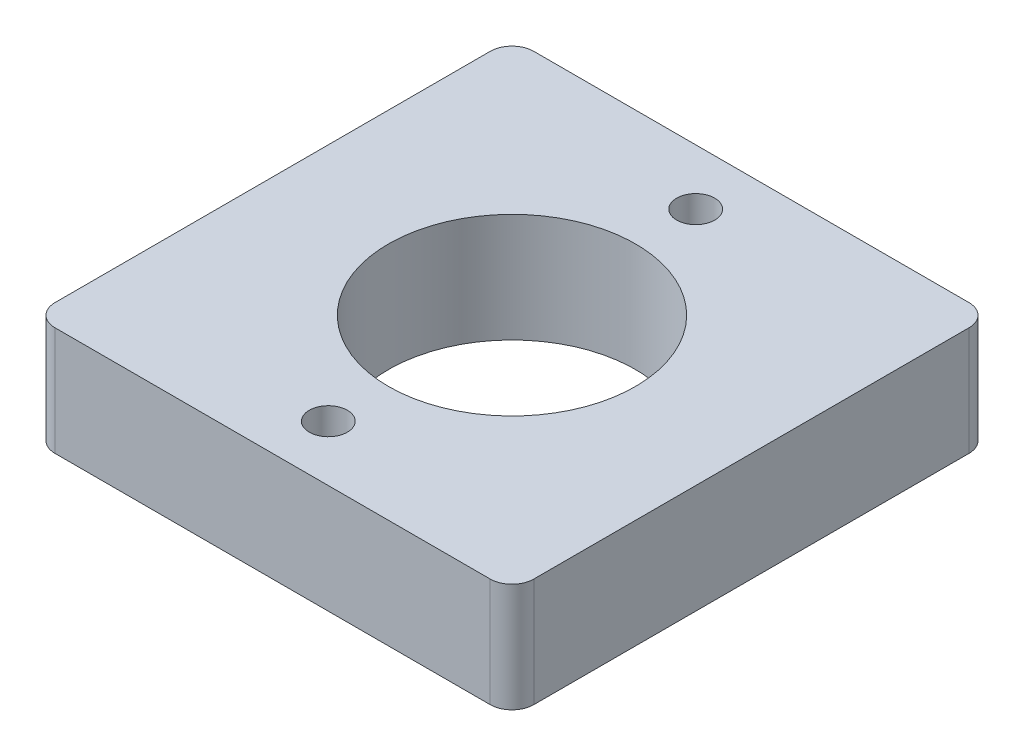
ISO-10303-21;
HEADER;
FILE_DESCRIPTION(('STEP AP214'),'2;1');
FILE_NAME('part.step','',(''),(''),'','','');
FILE_SCHEMA(('AUTOMOTIVE_DESIGN { 1 0 10303 214 1 1 1 1 }'));
ENDSEC;
DATA;
#1=APPLICATION_CONTEXT('core data for automotive mechanical design processes');
#2=APPLICATION_PROTOCOL_DEFINITION('international standard','automotive_design',2000,#1);
#3=PRODUCT_CONTEXT('',#1,'mechanical');
#4=PRODUCT('Part','Part','',(#3));
#5=PRODUCT_RELATED_PRODUCT_CATEGORY('part','',(#4));
#6=PRODUCT_DEFINITION_FORMATION('','',#4);
#7=PRODUCT_DEFINITION_CONTEXT('part definition',#1,'design');
#8=PRODUCT_DEFINITION('design','',#6,#7);
#9=PRODUCT_DEFINITION_SHAPE('','',#8);
#10=(LENGTH_UNIT() NAMED_UNIT(*) SI_UNIT(.MILLI.,.METRE.));
#11=(NAMED_UNIT(*) PLANE_ANGLE_UNIT() SI_UNIT($,.RADIAN.));
#12=(NAMED_UNIT(*) SI_UNIT($,.STERADIAN.) SOLID_ANGLE_UNIT());
#13=UNCERTAINTY_MEASURE_WITH_UNIT(LENGTH_MEASURE(1.E-05),#10,'distance_accuracy_value','');
#14=(GEOMETRIC_REPRESENTATION_CONTEXT(3) GLOBAL_UNCERTAINTY_ASSIGNED_CONTEXT((#13)) GLOBAL_UNIT_ASSIGNED_CONTEXT((#10,
#11,#12)) REPRESENTATION_CONTEXT('',''));
#15=CARTESIAN_POINT('',(0.,0.,0.));
#16=DIRECTION('',(0.,0.,1.));
#17=DIRECTION('',(1.,0.,0.));
#18=AXIS2_PLACEMENT_3D('',#15,#16,#17);
#19=CARTESIAN_POINT('',(0.,10.,0.));
#20=DIRECTION('',(0.,-1.,0.));
#21=DIRECTION('',(0.,0.,-1.));
#22=AXIS2_PLACEMENT_3D('',#19,#20,#21);
#23=PLANE('',#22);
#24=CARTESIAN_POINT('',(0.,10.,-16.88));
#25=DIRECTION('',(0.,1.,0.));
#26=DIRECTION('',(0.,0.,1.));
#27=AXIS2_PLACEMENT_3D('',#24,#25,#26);
#28=CIRCLE('',#27,1.75);
#29=CARTESIAN_POINT('',(0.,10.,-15.13));
#30=VERTEX_POINT('',#29);
#31=EDGE_CURVE('E192',#30,#30,#28,.T.);
#32=ORIENTED_EDGE('',*,*,#31,.F.);
#33=EDGE_LOOP('',(#32));
#34=FACE_BOUND('',#33,.T.);
#35=CARTESIAN_POINT('',(0.,10.,16.88));
#36=DIRECTION('',(0.,1.,0.));
#37=DIRECTION('',(0.,0.,1.));
#38=AXIS2_PLACEMENT_3D('',#35,#36,#37);
#39=CIRCLE('',#38,1.75);
#40=CARTESIAN_POINT('',(0.,10.,18.63));
#41=VERTEX_POINT('',#40);
#42=EDGE_CURVE('E186',#41,#41,#39,.T.);
#43=ORIENTED_EDGE('',*,*,#42,.F.);
#44=EDGE_LOOP('',(#43));
#45=FACE_BOUND('',#44,.T.);
#46=DIRECTION('',(0.,0.,-1.));
#47=VECTOR('',#46,1.);
#48=CARTESIAN_POINT('',(22.,10.,22.));
#49=LINE('',#48,#47);
#50=CARTESIAN_POINT('',(22.,10.,20.));
#51=VERTEX_POINT('',#50);
#52=CARTESIAN_POINT('',(22.,10.,-20.));
#53=VERTEX_POINT('',#52);
#54=EDGE_CURVE('E140',#51,#53,#49,.T.);
#55=ORIENTED_EDGE('',*,*,#54,.T.);
#56=CARTESIAN_POINT('',(20.,10.,-20.));
#57=DIRECTION('',(0.,-1.,0.));
#58=DIRECTION('',(0.,0.,-1.));
#59=AXIS2_PLACEMENT_3D('',#56,#57,#58);
#60=CIRCLE('',#59,2.);
#61=CARTESIAN_POINT('',(20.,10.,-22.));
#62=VERTEX_POINT('',#61);
#63=EDGE_CURVE('E155',#53,#62,#60,.F.);
#64=ORIENTED_EDGE('',*,*,#63,.T.);
#65=DIRECTION('',(-1.,0.,0.));
#66=VECTOR('',#65,1.);
#67=CARTESIAN_POINT('',(-22.,10.,-22.));
#68=LINE('',#67,#66);
#69=CARTESIAN_POINT('',(-20.,10.,-22.));
#70=VERTEX_POINT('',#69);
#71=EDGE_CURVE('E122',#62,#70,#68,.T.);
#72=ORIENTED_EDGE('',*,*,#71,.T.);
#73=CARTESIAN_POINT('',(-20.,10.,-20.));
#74=DIRECTION('',(0.,-1.,0.));
#75=DIRECTION('',(0.,0.,-1.));
#76=AXIS2_PLACEMENT_3D('',#73,#74,#75);
#77=CIRCLE('',#76,2.);
#78=CARTESIAN_POINT('',(-22.,10.,-20.));
#79=VERTEX_POINT('',#78);
#80=EDGE_CURVE('E150',#70,#79,#77,.F.);
#81=ORIENTED_EDGE('',*,*,#80,.T.);
#82=DIRECTION('',(0.,0.,1.));
#83=VECTOR('',#82,1.);
#84=CARTESIAN_POINT('',(-22.,10.,22.));
#85=LINE('',#84,#83);
#86=CARTESIAN_POINT('',(-22.,10.,20.));
#87=VERTEX_POINT('',#86);
#88=EDGE_CURVE('E166',#79,#87,#85,.T.);
#89=ORIENTED_EDGE('',*,*,#88,.T.);
#90=CARTESIAN_POINT('',(-20.,10.,20.));
#91=DIRECTION('',(0.,-1.,0.));
#92=DIRECTION('',(0.,0.,-1.));
#93=AXIS2_PLACEMENT_3D('',#90,#91,#92);
#94=CIRCLE('',#93,2.);
#95=CARTESIAN_POINT('',(-20.,10.,22.));
#96=VERTEX_POINT('',#95);
#97=EDGE_CURVE('E58',#87,#96,#94,.F.);
#98=ORIENTED_EDGE('',*,*,#97,.T.);
#99=DIRECTION('',(1.,0.,0.));
#100=VECTOR('',#99,1.);
#101=CARTESIAN_POINT('',(-22.,10.,22.));
#102=LINE('',#101,#100);
#103=CARTESIAN_POINT('',(20.,10.,22.));
#104=VERTEX_POINT('',#103);
#105=EDGE_CURVE('E141',#96,#104,#102,.T.);
#106=ORIENTED_EDGE('',*,*,#105,.T.);
#107=CARTESIAN_POINT('',(20.,10.,20.));
#108=DIRECTION('',(0.,-1.,0.));
#109=DIRECTION('',(0.,0.,-1.));
#110=AXIS2_PLACEMENT_3D('',#107,#108,#109);
#111=CIRCLE('',#110,2.);
#112=EDGE_CURVE('E153',#104,#51,#111,.F.);
#113=ORIENTED_EDGE('',*,*,#112,.T.);
#114=EDGE_LOOP('',(#55,#64,#72,#81,#89,#98,#106,#113));
#115=FACE_BOUND('',#114,.T.);
#116=CARTESIAN_POINT('',(0.,10.,0.));
#117=DIRECTION('',(0.,1.,0.));
#118=DIRECTION('',(0.,0.,1.));
#119=AXIS2_PLACEMENT_3D('',#116,#117,#118);
#120=CIRCLE('',#119,11.35);
#121=CARTESIAN_POINT('',(0.,10.,11.35));
#122=VERTEX_POINT('',#121);
#123=EDGE_CURVE('E135',#122,#122,#120,.T.);
#124=ORIENTED_EDGE('',*,*,#123,.F.);
#125=EDGE_LOOP('',(#124));
#126=FACE_BOUND('',#125,.T.);
#127=ADVANCED_FACE('F36',(#34,#45,#115,#126),#23,.F.);
#128=CARTESIAN_POINT('',(0.,0.,0.));
#129=DIRECTION('',(0.,-1.,0.));
#130=DIRECTION('',(0.,0.,-1.));
#131=AXIS2_PLACEMENT_3D('',#128,#129,#130);
#132=PLANE('',#131);
#133=CARTESIAN_POINT('',(0.,0.,-16.88));
#134=DIRECTION('',(0.,1.,0.));
#135=DIRECTION('',(0.,0.,1.));
#136=AXIS2_PLACEMENT_3D('',#133,#134,#135);
#137=CIRCLE('',#136,1.75);
#138=CARTESIAN_POINT('',(0.,0.,-15.13));
#139=VERTEX_POINT('',#138);
#140=EDGE_CURVE('E183',#139,#139,#137,.T.);
#141=ORIENTED_EDGE('',*,*,#140,.T.);
#142=EDGE_LOOP('',(#141));
#143=FACE_BOUND('',#142,.T.);
#144=CARTESIAN_POINT('',(0.,0.,16.88));
#145=DIRECTION('',(0.,1.,0.));
#146=DIRECTION('',(0.,0.,1.));
#147=AXIS2_PLACEMENT_3D('',#144,#145,#146);
#148=CIRCLE('',#147,1.75);
#149=CARTESIAN_POINT('',(0.,0.,18.63));
#150=VERTEX_POINT('',#149);
#151=EDGE_CURVE('E189',#150,#150,#148,.T.);
#152=ORIENTED_EDGE('',*,*,#151,.T.);
#153=EDGE_LOOP('',(#152));
#154=FACE_BOUND('',#153,.T.);
#155=DIRECTION('',(-1.,0.,0.));
#156=VECTOR('',#155,1.);
#157=CARTESIAN_POINT('',(-22.,0.,-22.));
#158=LINE('',#157,#156);
#159=CARTESIAN_POINT('',(20.,0.,-22.));
#160=VERTEX_POINT('',#159);
#161=CARTESIAN_POINT('',(-20.,0.,-22.));
#162=VERTEX_POINT('',#161);
#163=EDGE_CURVE('E119',#160,#162,#158,.T.);
#164=ORIENTED_EDGE('',*,*,#163,.F.);
#165=CARTESIAN_POINT('',(20.,0.,-20.));
#166=DIRECTION('',(0.,-1.,0.));
#167=DIRECTION('',(0.,0.,-1.));
#168=AXIS2_PLACEMENT_3D('',#165,#166,#167);
#169=CIRCLE('',#168,2.);
#170=CARTESIAN_POINT('',(22.,0.,-20.));
#171=VERTEX_POINT('',#170);
#172=EDGE_CURVE('E102',#160,#171,#169,.T.);
#173=ORIENTED_EDGE('',*,*,#172,.T.);
#174=DIRECTION('',(0.,0.,-1.));
#175=VECTOR('',#174,1.);
#176=CARTESIAN_POINT('',(22.,0.,22.));
#177=LINE('',#176,#175);
#178=CARTESIAN_POINT('',(22.,0.,20.));
#179=VERTEX_POINT('',#178);
#180=EDGE_CURVE('E130',#179,#171,#177,.T.);
#181=ORIENTED_EDGE('',*,*,#180,.F.);
#182=CARTESIAN_POINT('',(20.,0.,20.));
#183=DIRECTION('',(0.,-1.,0.));
#184=DIRECTION('',(0.,0.,-1.));
#185=AXIS2_PLACEMENT_3D('',#182,#183,#184);
#186=CIRCLE('',#185,2.);
#187=CARTESIAN_POINT('',(20.,0.,22.));
#188=VERTEX_POINT('',#187);
#189=EDGE_CURVE('E113',#179,#188,#186,.T.);
#190=ORIENTED_EDGE('',*,*,#189,.T.);
#191=DIRECTION('',(1.,0.,0.));
#192=VECTOR('',#191,1.);
#193=CARTESIAN_POINT('',(-22.,0.,22.));
#194=LINE('',#193,#192);
#195=CARTESIAN_POINT('',(-20.,0.,22.));
#196=VERTEX_POINT('',#195);
#197=EDGE_CURVE('E133',#196,#188,#194,.T.);
#198=ORIENTED_EDGE('',*,*,#197,.F.);
#199=CARTESIAN_POINT('',(-20.,0.,20.));
#200=DIRECTION('',(0.,-1.,0.));
#201=DIRECTION('',(0.,0.,-1.));
#202=AXIS2_PLACEMENT_3D('',#199,#200,#201);
#203=CIRCLE('',#202,2.);
#204=CARTESIAN_POINT('',(-22.,0.,20.));
#205=VERTEX_POINT('',#204);
#206=EDGE_CURVE('E144',#196,#205,#203,.T.);
#207=ORIENTED_EDGE('',*,*,#206,.T.);
#208=DIRECTION('',(0.,0.,1.));
#209=VECTOR('',#208,1.);
#210=CARTESIAN_POINT('',(-22.,0.,22.));
#211=LINE('',#210,#209);
#212=CARTESIAN_POINT('',(-22.,0.,-20.));
#213=VERTEX_POINT('',#212);
#214=EDGE_CURVE('E129',#213,#205,#211,.T.);
#215=ORIENTED_EDGE('',*,*,#214,.F.);
#216=CARTESIAN_POINT('',(-20.,0.,-20.));
#217=DIRECTION('',(0.,-1.,0.));
#218=DIRECTION('',(0.,0.,-1.));
#219=AXIS2_PLACEMENT_3D('',#216,#217,#218);
#220=CIRCLE('',#219,2.);
#221=EDGE_CURVE('E123',#213,#162,#220,.T.);
#222=ORIENTED_EDGE('',*,*,#221,.T.);
#223=EDGE_LOOP('',(#164,#173,#181,#190,#198,#207,#215,#222));
#224=FACE_BOUND('',#223,.T.);
#225=CARTESIAN_POINT('',(0.,0.,0.));
#226=DIRECTION('',(0.,1.,0.));
#227=DIRECTION('',(0.,0.,1.));
#228=AXIS2_PLACEMENT_3D('',#225,#226,#227);
#229=CIRCLE('',#228,11.35);
#230=CARTESIAN_POINT('',(0.,0.,11.35));
#231=VERTEX_POINT('',#230);
#232=EDGE_CURVE('E180',#231,#231,#229,.T.);
#233=ORIENTED_EDGE('',*,*,#232,.T.);
#234=EDGE_LOOP('',(#233));
#235=FACE_BOUND('',#234,.T.);
#236=ADVANCED_FACE('F126',(#143,#154,#224,#235),#132,.T.);
#237=CARTESIAN_POINT('',(22.,10.,22.));
#238=DIRECTION('',(-1.,0.,0.));
#239=DIRECTION('',(0.,0.,1.));
#240=AXIS2_PLACEMENT_3D('',#237,#238,#239);
#241=PLANE('',#240);
#242=ORIENTED_EDGE('',*,*,#180,.T.);
#243=DIRECTION('',(0.,-1.,0.));
#244=VECTOR('',#243,1.);
#245=CARTESIAN_POINT('',(22.,10.,-20.));
#246=LINE('',#245,#244);
#247=EDGE_CURVE('E107',#171,#53,#246,.F.);
#248=ORIENTED_EDGE('',*,*,#247,.T.);
#249=ORIENTED_EDGE('',*,*,#54,.F.);
#250=DIRECTION('',(0.,-1.,0.));
#251=VECTOR('',#250,1.);
#252=CARTESIAN_POINT('',(22.,10.,20.));
#253=LINE('',#252,#251);
#254=EDGE_CURVE('E112',#51,#179,#253,.T.);
#255=ORIENTED_EDGE('',*,*,#254,.T.);
#256=EDGE_LOOP('',(#242,#248,#249,#255));
#257=FACE_BOUND('',#256,.T.);
#258=ADVANCED_FACE('F221',(#257),#241,.F.);
#259=CARTESIAN_POINT('',(-22.,10.,-22.));
#260=DIRECTION('',(0.,0.,1.));
#261=DIRECTION('',(1.,0.,0.));
#262=AXIS2_PLACEMENT_3D('',#259,#260,#261);
#263=PLANE('',#262);
#264=ORIENTED_EDGE('',*,*,#71,.F.);
#265=DIRECTION('',(0.,-1.,0.));
#266=VECTOR('',#265,1.);
#267=CARTESIAN_POINT('',(20.,10.,-22.));
#268=LINE('',#267,#266);
#269=EDGE_CURVE('E106',#62,#160,#268,.T.);
#270=ORIENTED_EDGE('',*,*,#269,.T.);
#271=ORIENTED_EDGE('',*,*,#163,.T.);
#272=DIRECTION('',(0.,-1.,0.));
#273=VECTOR('',#272,1.);
#274=CARTESIAN_POINT('',(-20.,10.,-22.));
#275=LINE('',#274,#273);
#276=EDGE_CURVE('E124',#162,#70,#275,.F.);
#277=ORIENTED_EDGE('',*,*,#276,.T.);
#278=EDGE_LOOP('',(#264,#270,#271,#277));
#279=FACE_BOUND('',#278,.T.);
#280=ADVANCED_FACE('F118',(#279),#263,.F.);
#281=CARTESIAN_POINT('',(-22.,10.,22.));
#282=DIRECTION('',(1.,0.,0.));
#283=DIRECTION('',(0.,0.,-1.));
#284=AXIS2_PLACEMENT_3D('',#281,#282,#283);
#285=PLANE('',#284);
#286=ORIENTED_EDGE('',*,*,#214,.T.);
#287=DIRECTION('',(0.,-1.,0.));
#288=VECTOR('',#287,1.);
#289=CARTESIAN_POINT('',(-22.,10.,20.));
#290=LINE('',#289,#288);
#291=EDGE_CURVE('E11',#205,#87,#290,.F.);
#292=ORIENTED_EDGE('',*,*,#291,.T.);
#293=ORIENTED_EDGE('',*,*,#88,.F.);
#294=DIRECTION('',(0.,-1.,0.));
#295=VECTOR('',#294,1.);
#296=CARTESIAN_POINT('',(-22.,10.,-20.));
#297=LINE('',#296,#295);
#298=EDGE_CURVE('E44',#79,#213,#297,.T.);
#299=ORIENTED_EDGE('',*,*,#298,.T.);
#300=EDGE_LOOP('',(#286,#292,#293,#299));
#301=FACE_BOUND('',#300,.T.);
#302=ADVANCED_FACE('F164',(#301),#285,.F.);
#303=CARTESIAN_POINT('',(-22.,10.,22.));
#304=DIRECTION('',(0.,0.,-1.));
#305=DIRECTION('',(-1.,0.,0.));
#306=AXIS2_PLACEMENT_3D('',#303,#304,#305);
#307=PLANE('',#306);
#308=ORIENTED_EDGE('',*,*,#197,.T.);
#309=DIRECTION('',(0.,-1.,0.));
#310=VECTOR('',#309,1.);
#311=CARTESIAN_POINT('',(20.,10.,22.));
#312=LINE('',#311,#310);
#313=EDGE_CURVE('E51',#188,#104,#312,.F.);
#314=ORIENTED_EDGE('',*,*,#313,.T.);
#315=ORIENTED_EDGE('',*,*,#105,.F.);
#316=DIRECTION('',(0.,-1.,0.));
#317=VECTOR('',#316,1.);
#318=CARTESIAN_POINT('',(-20.,10.,22.));
#319=LINE('',#318,#317);
#320=EDGE_CURVE('E157',#96,#196,#319,.T.);
#321=ORIENTED_EDGE('',*,*,#320,.T.);
#322=EDGE_LOOP('',(#308,#314,#315,#321));
#323=FACE_BOUND('',#322,.T.);
#324=ADVANCED_FACE('F173',(#323),#307,.F.);
#325=CARTESIAN_POINT('',(0.,10.,0.));
#326=DIRECTION('',(0.,-1.,0.));
#327=DIRECTION('',(0.,0.,-1.));
#328=AXIS2_PLACEMENT_3D('',#325,#326,#327);
#329=CYLINDRICAL_SURFACE('',#328,11.35);
#330=ORIENTED_EDGE('',*,*,#123,.T.);
#331=EDGE_LOOP('',(#330));
#332=FACE_BOUND('',#331,.T.);
#333=ORIENTED_EDGE('',*,*,#232,.F.);
#334=EDGE_LOOP('',(#333));
#335=FACE_BOUND('',#334,.T.);
#336=ADVANCED_FACE('F215',(#332,#335),#329,.F.);
#337=CARTESIAN_POINT('',(0.,0.,16.88));
#338=DIRECTION('',(0.,1.,0.));
#339=DIRECTION('',(0.,0.,1.));
#340=AXIS2_PLACEMENT_3D('',#337,#338,#339);
#341=CYLINDRICAL_SURFACE('',#340,1.75);
#342=ORIENTED_EDGE('',*,*,#151,.F.);
#343=EDGE_LOOP('',(#342));
#344=FACE_BOUND('',#343,.T.);
#345=ORIENTED_EDGE('',*,*,#42,.T.);
#346=EDGE_LOOP('',(#345));
#347=FACE_BOUND('',#346,.T.);
#348=ADVANCED_FACE('F203',(#344,#347),#341,.F.);
#349=CARTESIAN_POINT('',(0.,0.,-16.88));
#350=DIRECTION('',(0.,1.,0.));
#351=DIRECTION('',(0.,0.,1.));
#352=AXIS2_PLACEMENT_3D('',#349,#350,#351);
#353=CYLINDRICAL_SURFACE('',#352,1.75);
#354=ORIENTED_EDGE('',*,*,#140,.F.);
#355=EDGE_LOOP('',(#354));
#356=FACE_BOUND('',#355,.T.);
#357=ORIENTED_EDGE('',*,*,#31,.T.);
#358=EDGE_LOOP('',(#357));
#359=FACE_BOUND('',#358,.T.);
#360=ADVANCED_FACE('F200',(#356,#359),#353,.F.);
#361=CARTESIAN_POINT('',(20.,10.,-20.));
#362=DIRECTION('',(0.,-1.,0.));
#363=DIRECTION('',(0.,0.,-1.));
#364=AXIS2_PLACEMENT_3D('',#361,#362,#363);
#365=CYLINDRICAL_SURFACE('',#364,2.);
#366=ORIENTED_EDGE('',*,*,#63,.F.);
#367=ORIENTED_EDGE('',*,*,#247,.F.);
#368=ORIENTED_EDGE('',*,*,#172,.F.);
#369=ORIENTED_EDGE('',*,*,#269,.F.);
#370=EDGE_LOOP('',(#366,#367,#368,#369));
#371=FACE_BOUND('',#370,.T.);
#372=ADVANCED_FACE('F105',(#371),#365,.T.);
#373=CARTESIAN_POINT('',(20.,10.,20.));
#374=DIRECTION('',(0.,-1.,0.));
#375=DIRECTION('',(0.,0.,-1.));
#376=AXIS2_PLACEMENT_3D('',#373,#374,#375);
#377=CYLINDRICAL_SURFACE('',#376,2.);
#378=ORIENTED_EDGE('',*,*,#112,.F.);
#379=ORIENTED_EDGE('',*,*,#313,.F.);
#380=ORIENTED_EDGE('',*,*,#189,.F.);
#381=ORIENTED_EDGE('',*,*,#254,.F.);
#382=EDGE_LOOP('',(#378,#379,#380,#381));
#383=FACE_BOUND('',#382,.T.);
#384=ADVANCED_FACE('F237',(#383),#377,.T.);
#385=CARTESIAN_POINT('',(-20.,10.,20.));
#386=DIRECTION('',(0.,-1.,0.));
#387=DIRECTION('',(0.,0.,-1.));
#388=AXIS2_PLACEMENT_3D('',#385,#386,#387);
#389=CYLINDRICAL_SURFACE('',#388,2.);
#390=ORIENTED_EDGE('',*,*,#97,.F.);
#391=ORIENTED_EDGE('',*,*,#291,.F.);
#392=ORIENTED_EDGE('',*,*,#206,.F.);
#393=ORIENTED_EDGE('',*,*,#320,.F.);
#394=EDGE_LOOP('',(#390,#391,#392,#393));
#395=FACE_BOUND('',#394,.T.);
#396=ADVANCED_FACE('F172',(#395),#389,.T.);
#397=CARTESIAN_POINT('',(-20.,10.,-20.));
#398=DIRECTION('',(0.,-1.,0.));
#399=DIRECTION('',(0.,0.,-1.));
#400=AXIS2_PLACEMENT_3D('',#397,#398,#399);
#401=CYLINDRICAL_SURFACE('',#400,2.);
#402=ORIENTED_EDGE('',*,*,#80,.F.);
#403=ORIENTED_EDGE('',*,*,#276,.F.);
#404=ORIENTED_EDGE('',*,*,#221,.F.);
#405=ORIENTED_EDGE('',*,*,#298,.F.);
#406=EDGE_LOOP('',(#402,#403,#404,#405));
#407=FACE_BOUND('',#406,.T.);
#408=ADVANCED_FACE('F38',(#407),#401,.T.);
#409=CLOSED_SHELL('',(#127,#236,#258,#280,#302,#324,#336,#348,#360,#372,#384,#396,#408));
#410=MANIFOLD_SOLID_BREP('B2',#409);
#411=ADVANCED_BREP_SHAPE_REPRESENTATION('',(#18,#410),#14);
#412=SHAPE_DEFINITION_REPRESENTATION(#9,#411);
ENDSEC;
END-ISO-10303-21;
